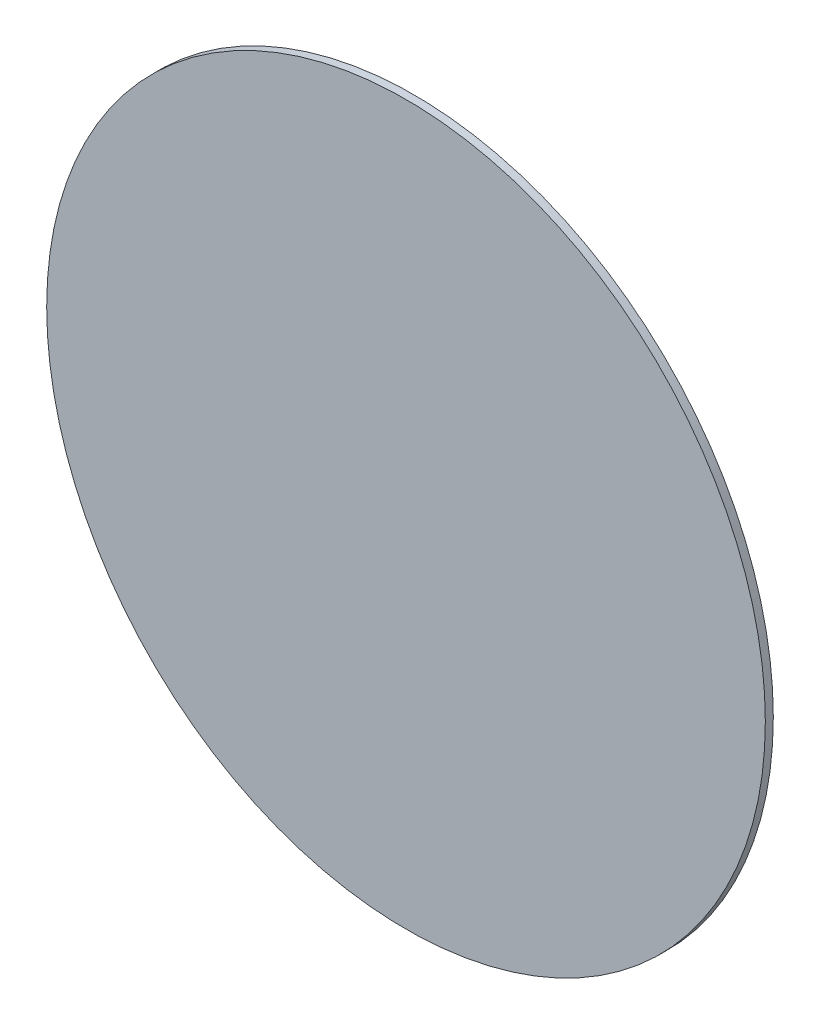
ISO-10303-21;
HEADER;
FILE_DESCRIPTION(('STEP AP214'),'2;1');
FILE_NAME('part.step','',(''),(''),'','','');
FILE_SCHEMA(('AUTOMOTIVE_DESIGN { 1 0 10303 214 1 1 1 1 }'));
ENDSEC;
DATA;
#1=APPLICATION_CONTEXT('core data for automotive mechanical design processes');
#2=APPLICATION_PROTOCOL_DEFINITION('international standard','automotive_design',2000,#1);
#3=PRODUCT_CONTEXT('',#1,'mechanical');
#4=PRODUCT('Part','Part','',(#3));
#5=PRODUCT_RELATED_PRODUCT_CATEGORY('part','',(#4));
#6=PRODUCT_DEFINITION_FORMATION('','',#4);
#7=PRODUCT_DEFINITION_CONTEXT('part definition',#1,'design');
#8=PRODUCT_DEFINITION('design','',#6,#7);
#9=PRODUCT_DEFINITION_SHAPE('','',#8);
#10=(LENGTH_UNIT() NAMED_UNIT(*) SI_UNIT(.MILLI.,.METRE.));
#11=(NAMED_UNIT(*) PLANE_ANGLE_UNIT() SI_UNIT($,.RADIAN.));
#12=(NAMED_UNIT(*) SI_UNIT($,.STERADIAN.) SOLID_ANGLE_UNIT());
#13=UNCERTAINTY_MEASURE_WITH_UNIT(LENGTH_MEASURE(1.E-05),#10,'distance_accuracy_value','');
#14=(GEOMETRIC_REPRESENTATION_CONTEXT(3) GLOBAL_UNCERTAINTY_ASSIGNED_CONTEXT((#13)) GLOBAL_UNIT_ASSIGNED_CONTEXT((#10,
#11,#12)) REPRESENTATION_CONTEXT('',''));
#15=CARTESIAN_POINT('',(0.,0.,0.));
#16=DIRECTION('',(0.,0.,1.));
#17=DIRECTION('',(1.,0.,0.));
#18=AXIS2_PLACEMENT_3D('',#15,#16,#17);
#19=CARTESIAN_POINT('',(0.,0.,1.99999999999998));
#20=DIRECTION('',(0.,0.,-1.));
#21=DIRECTION('',(-1.,0.,0.));
#22=AXIS2_PLACEMENT_3D('',#19,#20,#21);
#23=CYLINDRICAL_SURFACE('',#22,90.);
#24=CARTESIAN_POINT('',(0.,0.,1.99999999999998));
#25=DIRECTION('',(0.,0.,1.));
#26=DIRECTION('',(1.,0.,0.));
#27=AXIS2_PLACEMENT_3D('',#24,#25,#26);
#28=CIRCLE('',#27,90.);
#29=CARTESIAN_POINT('',(90.,0.,1.99999999999998));
#30=VERTEX_POINT('',#29);
#31=EDGE_CURVE('E10',#30,#30,#28,.T.);
#32=ORIENTED_EDGE('',*,*,#31,.F.);
#33=EDGE_LOOP('',(#32));
#34=FACE_BOUND('',#33,.T.);
#35=CARTESIAN_POINT('',(0.,0.,0.));
#36=DIRECTION('',(0.,0.,1.));
#37=DIRECTION('',(1.,0.,0.));
#38=AXIS2_PLACEMENT_3D('',#35,#36,#37);
#39=CIRCLE('',#38,90.);
#40=CARTESIAN_POINT('',(90.,0.,0.));
#41=VERTEX_POINT('',#40);
#42=EDGE_CURVE('E40',#41,#41,#39,.T.);
#43=ORIENTED_EDGE('',*,*,#42,.T.);
#44=EDGE_LOOP('',(#43));
#45=FACE_BOUND('',#44,.T.);
#46=ADVANCED_FACE('F37',(#34,#45),#23,.T.);
#47=CARTESIAN_POINT('',(0.,0.,1.99999999999998));
#48=DIRECTION('',(0.,0.,1.));
#49=DIRECTION('',(1.,0.,0.));
#50=AXIS2_PLACEMENT_3D('',#47,#48,#49);
#51=PLANE('',#50);
#52=ORIENTED_EDGE('',*,*,#31,.T.);
#53=EDGE_LOOP('',(#52));
#54=FACE_BOUND('',#53,.T.);
#55=ADVANCED_FACE('F52',(#54),#51,.T.);
#56=CARTESIAN_POINT('',(0.,0.,0.));
#57=DIRECTION('',(0.,0.,1.));
#58=DIRECTION('',(1.,0.,0.));
#59=AXIS2_PLACEMENT_3D('',#56,#57,#58);
#60=PLANE('',#59);
#61=ORIENTED_EDGE('',*,*,#42,.F.);
#62=EDGE_LOOP('',(#61));
#63=FACE_BOUND('',#62,.T.);
#64=ADVANCED_FACE('F50',(#63),#60,.F.);
#65=CLOSED_SHELL('',(#46,#55,#64));
#66=MANIFOLD_SOLID_BREP('B2',#65);
#67=ADVANCED_BREP_SHAPE_REPRESENTATION('',(#18,#66),#14);
#68=SHAPE_DEFINITION_REPRESENTATION(#9,#67);
ENDSEC;
END-ISO-10303-21;
